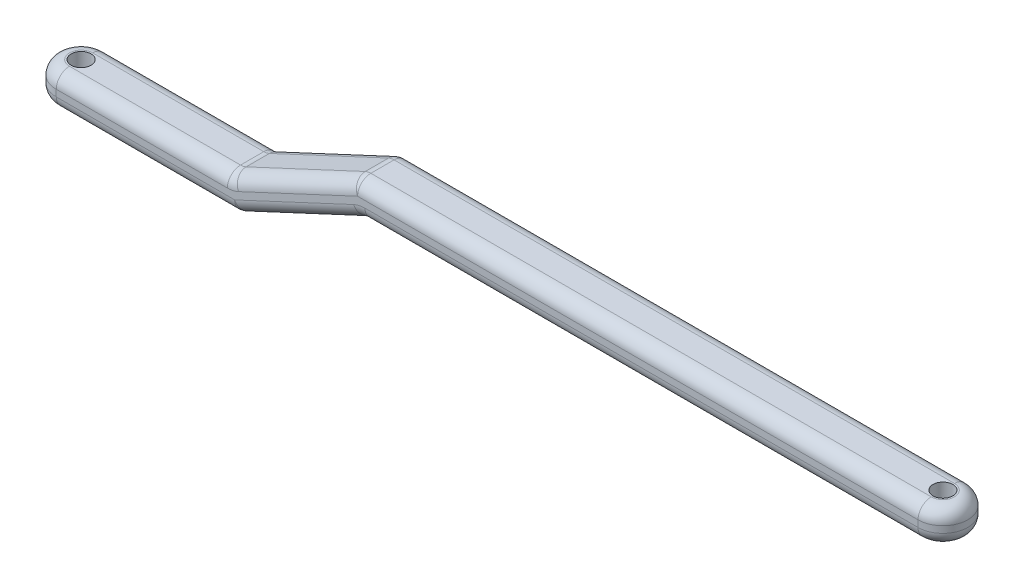
ISO-10303-21;
HEADER;
FILE_DESCRIPTION(('STEP AP214'),'2;1');
FILE_NAME('part.step','',(''),(''),'','','');
FILE_SCHEMA(('AUTOMOTIVE_DESIGN { 1 0 10303 214 1 1 1 1 }'));
ENDSEC;
DATA;
#1=APPLICATION_CONTEXT('core data for automotive mechanical design processes');
#2=APPLICATION_PROTOCOL_DEFINITION('international standard','automotive_design',2000,#1);
#3=PRODUCT_CONTEXT('',#1,'mechanical');
#4=PRODUCT('Part','Part','',(#3));
#5=PRODUCT_RELATED_PRODUCT_CATEGORY('part','',(#4));
#6=PRODUCT_DEFINITION_FORMATION('','',#4);
#7=PRODUCT_DEFINITION_CONTEXT('part definition',#1,'design');
#8=PRODUCT_DEFINITION('design','',#6,#7);
#9=PRODUCT_DEFINITION_SHAPE('','',#8);
#10=(LENGTH_UNIT() NAMED_UNIT(*) SI_UNIT(.MILLI.,.METRE.));
#11=(NAMED_UNIT(*) PLANE_ANGLE_UNIT() SI_UNIT($,.RADIAN.));
#12=(NAMED_UNIT(*) SI_UNIT($,.STERADIAN.) SOLID_ANGLE_UNIT());
#13=UNCERTAINTY_MEASURE_WITH_UNIT(LENGTH_MEASURE(1.E-05),#10,'distance_accuracy_value','');
#14=(GEOMETRIC_REPRESENTATION_CONTEXT(3) GLOBAL_UNCERTAINTY_ASSIGNED_CONTEXT((#13)) GLOBAL_UNIT_ASSIGNED_CONTEXT((#10,
#11,#12)) REPRESENTATION_CONTEXT('',''));
#15=CARTESIAN_POINT('',(0.,0.,0.));
#16=DIRECTION('',(0.,0.,1.));
#17=DIRECTION('',(1.,0.,0.));
#18=AXIS2_PLACEMENT_3D('',#15,#16,#17);
#19=CARTESIAN_POINT('',(0.,13.75,0.));
#20=DIRECTION('',(0.,1.,0.));
#21=DIRECTION('',(0.,0.,1.));
#22=AXIS2_PLACEMENT_3D('',#19,#20,#21);
#23=PLANE('',#22);
#24=DIRECTION('',(-1.,0.,0.));
#25=VECTOR('',#24,1.);
#26=CARTESIAN_POINT('',(-169.971128891083,13.75,-3.5));
#27=LINE('',#26,#25);
#28=CARTESIAN_POINT('',(0.,13.75,-3.5));
#29=VERTEX_POINT('',#28);
#30=CARTESIAN_POINT('',(-169.084350240511,13.75,-3.5));
#31=VERTEX_POINT('',#30);
#32=EDGE_CURVE('E278',#29,#31,#27,.T.);
#33=ORIENTED_EDGE('',*,*,#32,.T.);
#34=DIRECTION('',(0.,0.,1.));
#35=VECTOR('',#34,1.);
#36=CARTESIAN_POINT('',(-169.084350240511,13.75,0.));
#37=LINE('',#36,#35);
#38=CARTESIAN_POINT('',(-169.084350240511,13.75,3.5));
#39=VERTEX_POINT('',#38);
#40=EDGE_CURVE('E283',#31,#39,#37,.T.);
#41=ORIENTED_EDGE('',*,*,#40,.T.);
#42=DIRECTION('',(1.,0.,0.));
#43=VECTOR('',#42,1.);
#44=CARTESIAN_POINT('',(0.,13.75,3.5));
#45=LINE('',#44,#43);
#46=CARTESIAN_POINT('',(0.,13.75,3.5));
#47=VERTEX_POINT('',#46);
#48=EDGE_CURVE('E280',#39,#47,#45,.T.);
#49=ORIENTED_EDGE('',*,*,#48,.T.);
#50=CARTESIAN_POINT('',(0.,13.75,0.));
#51=DIRECTION('',(0.,1.,0.));
#52=DIRECTION('',(0.,0.,1.));
#53=AXIS2_PLACEMENT_3D('',#50,#51,#52);
#54=CIRCLE('',#53,3.5);
#55=EDGE_CURVE('E276',#47,#29,#54,.T.);
#56=ORIENTED_EDGE('',*,*,#55,.T.);
#57=EDGE_LOOP('',(#33,#41,#49,#56));
#58=FACE_BOUND('',#57,.T.);
#59=CARTESIAN_POINT('',(0.,13.75,0.));
#60=DIRECTION('',(0.,1.,0.));
#61=DIRECTION('',(0.,0.,1.));
#62=AXIS2_PLACEMENT_3D('',#59,#60,#61);
#63=CIRCLE('',#62,3.);
#64=CARTESIAN_POINT('',(0.,13.75,3.));
#65=VERTEX_POINT('',#64);
#66=EDGE_CURVE('E840',#65,#65,#63,.T.);
#67=ORIENTED_EDGE('',*,*,#66,.F.);
#68=EDGE_LOOP('',(#67));
#69=FACE_BOUND('',#68,.T.);
#70=ADVANCED_FACE('F41',(#58,#69),#23,.T.);
#71=CARTESIAN_POINT('',(0.,-13.75,0.));
#72=DIRECTION('',(0.,1.,0.));
#73=DIRECTION('',(0.,0.,1.));
#74=AXIS2_PLACEMENT_3D('',#71,#72,#73);
#75=PLANE('',#74);
#76=DIRECTION('',(0.,0.,1.));
#77=VECTOR('',#76,1.);
#78=CARTESIAN_POINT('',(-206.169832024142,-13.75,7.5));
#79=LINE('',#78,#77);
#80=CARTESIAN_POINT('',(-206.169832024142,-13.75,-3.5));
#81=VERTEX_POINT('',#80);
#82=CARTESIAN_POINT('',(-206.169832024142,-13.75,3.5));
#83=VERTEX_POINT('',#82);
#84=EDGE_CURVE('E796',#81,#83,#79,.T.);
#85=ORIENTED_EDGE('',*,*,#84,.T.);
#86=DIRECTION('',(1.,0.,0.));
#87=VECTOR('',#86,1.);
#88=CARTESIAN_POINT('',(0.,-13.75,3.5));
#89=LINE('',#88,#87);
#90=CARTESIAN_POINT('',(-260.,-13.75,3.5));
#91=VERTEX_POINT('',#90);
#92=EDGE_CURVE('E228',#83,#91,#89,.F.);
#93=ORIENTED_EDGE('',*,*,#92,.T.);
#94=CARTESIAN_POINT('',(-260.,-13.75,0.));
#95=DIRECTION('',(0.,1.,0.));
#96=DIRECTION('',(0.,0.,1.));
#97=AXIS2_PLACEMENT_3D('',#94,#95,#96);
#98=CIRCLE('',#97,3.5);
#99=CARTESIAN_POINT('',(-260.,-13.75,-3.5));
#100=VERTEX_POINT('',#99);
#101=EDGE_CURVE('E233',#91,#100,#98,.F.);
#102=ORIENTED_EDGE('',*,*,#101,.T.);
#103=DIRECTION('',(-1.,0.,0.));
#104=VECTOR('',#103,1.);
#105=CARTESIAN_POINT('',(0.,-13.75,-3.5));
#106=LINE('',#105,#104);
#107=EDGE_CURVE('E794',#100,#81,#106,.F.);
#108=ORIENTED_EDGE('',*,*,#107,.T.);
#109=EDGE_LOOP('',(#85,#93,#102,#108));
#110=FACE_BOUND('',#109,.T.);
#111=CARTESIAN_POINT('',(-260.,-13.75,0.));
#112=DIRECTION('',(0.,1.,0.));
#113=DIRECTION('',(0.,0.,1.));
#114=AXIS2_PLACEMENT_3D('',#111,#112,#113);
#115=CIRCLE('',#114,2.99999999999999);
#116=CARTESIAN_POINT('',(-260.,-13.75,2.99999999999999));
#117=VERTEX_POINT('',#116);
#118=EDGE_CURVE('E760',#117,#117,#115,.T.);
#119=ORIENTED_EDGE('',*,*,#118,.T.);
#120=EDGE_LOOP('',(#119));
#121=FACE_BOUND('',#120,.T.);
#122=ADVANCED_FACE('F421',(#110,#121),#75,.F.);
#123=CARTESIAN_POINT('',(0.,13.75,0.));
#124=DIRECTION('',(0.,-1.,0.));
#125=DIRECTION('',(0.,0.,-1.));
#126=AXIS2_PLACEMENT_3D('',#123,#124,#125);
#127=CYLINDRICAL_SURFACE('',#126,7.5);
#128=DIRECTION('',(0.,-1.,0.));
#129=VECTOR('',#128,1.);
#130=CARTESIAN_POINT('',(0.,13.75,7.5));
#131=LINE('',#130,#129);
#132=CARTESIAN_POINT('',(0.,9.75,7.5));
#133=VERTEX_POINT('',#132);
#134=CARTESIAN_POINT('',(0.,7.75,7.5));
#135=VERTEX_POINT('',#134);
#136=EDGE_CURVE('E213',#133,#135,#131,.T.);
#137=ORIENTED_EDGE('',*,*,#136,.T.);
#138=CARTESIAN_POINT('',(0.,7.75,0.));
#139=DIRECTION('',(0.,-1.,0.));
#140=DIRECTION('',(0.,0.,-1.));
#141=AXIS2_PLACEMENT_3D('',#138,#139,#140);
#142=CIRCLE('',#141,7.5);
#143=CARTESIAN_POINT('',(0.,7.75,-7.5));
#144=VERTEX_POINT('',#143);
#145=EDGE_CURVE('E247',#135,#144,#142,.F.);
#146=ORIENTED_EDGE('',*,*,#145,.T.);
#147=DIRECTION('',(0.,-1.,0.));
#148=VECTOR('',#147,1.);
#149=CARTESIAN_POINT('',(0.,13.75,-7.5));
#150=LINE('',#149,#148);
#151=CARTESIAN_POINT('',(0.,9.75,-7.5));
#152=VERTEX_POINT('',#151);
#153=EDGE_CURVE('E769',#152,#144,#150,.T.);
#154=ORIENTED_EDGE('',*,*,#153,.F.);
#155=CARTESIAN_POINT('',(0.,9.75,0.));
#156=DIRECTION('',(0.,1.,0.));
#157=DIRECTION('',(0.,0.,1.));
#158=AXIS2_PLACEMENT_3D('',#155,#156,#157);
#159=CIRCLE('',#158,7.5);
#160=EDGE_CURVE('E245',#152,#133,#159,.F.);
#161=ORIENTED_EDGE('',*,*,#160,.T.);
#162=EDGE_LOOP('',(#137,#146,#154,#161));
#163=FACE_BOUND('',#162,.T.);
#164=ADVANCED_FACE('F427',(#163),#127,.T.);
#165=CARTESIAN_POINT('',(0.,13.75,-7.5));
#166=DIRECTION('',(0.,0.,1.));
#167=DIRECTION('',(1.,0.,0.));
#168=AXIS2_PLACEMENT_3D('',#165,#166,#167);
#169=PLANE('',#168);
#170=DIRECTION('',(0.906307787036649,0.422618261740701,0.));
#171=VECTOR('',#170,1.);
#172=CARTESIAN_POINT('',(-206.973526420533,-10.1247688518534,-7.5));
#173=LINE('',#172,#171);
#174=CARTESIAN_POINT('',(-170.248349708007,7.00046229629319,-7.5));
#175=VERTEX_POINT('',#174);
#176=CARTESIAN_POINT('',(-206.169832024142,-9.75,-7.5));
#177=VERTEX_POINT('',#176);
#178=EDGE_CURVE('E267',#175,#177,#173,.F.);
#179=ORIENTED_EDGE('',*,*,#178,.T.);
#180=DIRECTION('',(-1.,0.,0.));
#181=VECTOR('',#180,1.);
#182=CARTESIAN_POINT('',(0.,-9.75,-7.5));
#183=LINE('',#182,#181);
#184=CARTESIAN_POINT('',(-260.,-9.75,-7.5));
#185=VERTEX_POINT('',#184);
#186=EDGE_CURVE('E274',#177,#185,#183,.T.);
#187=ORIENTED_EDGE('',*,*,#186,.T.);
#188=DIRECTION('',(0.,-1.,0.));
#189=VECTOR('',#188,1.);
#190=CARTESIAN_POINT('',(-260.,13.75,-7.5));
#191=LINE('',#190,#189);
#192=CARTESIAN_POINT('',(-260.,-7.75,-7.5));
#193=VERTEX_POINT('',#192);
#194=EDGE_CURVE('E212',#193,#185,#191,.T.);
#195=ORIENTED_EDGE('',*,*,#194,.F.);
#196=DIRECTION('',(-1.,0.,0.));
#197=VECTOR('',#196,1.);
#198=CARTESIAN_POINT('',(-207.5,-7.74999999999999,-7.5));
#199=LINE('',#198,#197);
#200=CARTESIAN_POINT('',(-208.386778650572,-7.74999999999999,-7.5));
#201=VERTEX_POINT('',#200);
#202=EDGE_CURVE('E264',#193,#201,#199,.F.);
#203=ORIENTED_EDGE('',*,*,#202,.T.);
#204=CARTESIAN_POINT('',(-208.386778650572,0.250000000000007,-7.5));
#205=DIRECTION('',(0.,0.,1.));
#206=DIRECTION('',(1.,0.,0.));
#207=AXIS2_PLACEMENT_3D('',#204,#205,#206);
#208=CIRCLE('',#207,8.);
#209=CARTESIAN_POINT('',(-205.005832556646,-7.00046229629318,-7.5));
#210=VERTEX_POINT('',#209);
#211=EDGE_CURVE('E261',#210,#201,#208,.F.);
#212=ORIENTED_EDGE('',*,*,#211,.F.);
#213=DIRECTION('',(-0.906307787036649,-0.422618261740701,0.));
#214=VECTOR('',#213,1.);
#215=CARTESIAN_POINT('',(-168.28065584412,10.1247688518534,-7.5));
#216=LINE('',#215,#214);
#217=CARTESIAN_POINT('',(-169.084350240511,9.74999999999999,-7.5));
#218=VERTEX_POINT('',#217);
#219=EDGE_CURVE('E257',#210,#218,#216,.F.);
#220=ORIENTED_EDGE('',*,*,#219,.T.);
#221=DIRECTION('',(-1.,0.,0.));
#222=VECTOR('',#221,1.);
#223=CARTESIAN_POINT('',(0.,9.75,-7.5));
#224=LINE('',#223,#222);
#225=EDGE_CURVE('E259',#218,#152,#224,.F.);
#226=ORIENTED_EDGE('',*,*,#225,.T.);
#227=ORIENTED_EDGE('',*,*,#153,.T.);
#228=DIRECTION('',(1.,0.,0.));
#229=VECTOR('',#228,1.);
#230=CARTESIAN_POINT('',(-167.754182264654,7.75,-7.5));
#231=LINE('',#230,#229);
#232=CARTESIAN_POINT('',(-166.867403614082,7.75,-7.5));
#233=VERTEX_POINT('',#232);
#234=EDGE_CURVE('E272',#144,#233,#231,.F.);
#235=ORIENTED_EDGE('',*,*,#234,.T.);
#236=CARTESIAN_POINT('',(-166.867403614082,-0.25,-7.5));
#237=DIRECTION('',(0.,0.,1.));
#238=DIRECTION('',(1.,0.,0.));
#239=AXIS2_PLACEMENT_3D('',#236,#237,#238);
#240=CIRCLE('',#239,8.);
#241=EDGE_CURVE('E269',#175,#233,#240,.F.);
#242=ORIENTED_EDGE('',*,*,#241,.F.);
#243=EDGE_LOOP('',(#179,#187,#195,#203,#212,#220,#226,#227,#235,#242));
#244=FACE_BOUND('',#243,.T.);
#245=ADVANCED_FACE('F438',(#244),#169,.F.);
#246=CARTESIAN_POINT('',(-260.,13.75,0.));
#247=DIRECTION('',(0.,-1.,0.));
#248=DIRECTION('',(0.,0.,-1.));
#249=AXIS2_PLACEMENT_3D('',#246,#247,#248);
#250=CYLINDRICAL_SURFACE('',#249,7.5);
#251=ORIENTED_EDGE('',*,*,#194,.T.);
#252=CARTESIAN_POINT('',(-260.,-9.75,0.));
#253=DIRECTION('',(0.,1.,0.));
#254=DIRECTION('',(0.,0.,1.));
#255=AXIS2_PLACEMENT_3D('',#252,#253,#254);
#256=CIRCLE('',#255,7.5);
#257=CARTESIAN_POINT('',(-260.,-9.75,7.5));
#258=VERTEX_POINT('',#257);
#259=EDGE_CURVE('E211',#185,#258,#256,.T.);
#260=ORIENTED_EDGE('',*,*,#259,.T.);
#261=DIRECTION('',(0.,-1.,0.));
#262=VECTOR('',#261,1.);
#263=CARTESIAN_POINT('',(-260.,13.75,7.5));
#264=LINE('',#263,#262);
#265=CARTESIAN_POINT('',(-260.,-7.75,7.5));
#266=VERTEX_POINT('',#265);
#267=EDGE_CURVE('E193',#266,#258,#264,.T.);
#268=ORIENTED_EDGE('',*,*,#267,.F.);
#269=CARTESIAN_POINT('',(-260.,-7.75,0.));
#270=DIRECTION('',(0.,1.,0.));
#271=DIRECTION('',(-1.,0.,0.));
#272=AXIS2_PLACEMENT_3D('',#269,#270,#271);
#273=CIRCLE('',#272,7.5);
#274=EDGE_CURVE('E208',#266,#193,#273,.F.);
#275=ORIENTED_EDGE('',*,*,#274,.T.);
#276=EDGE_LOOP('',(#251,#260,#268,#275));
#277=FACE_BOUND('',#276,.T.);
#278=ADVANCED_FACE('F206',(#277),#250,.T.);
#279=CARTESIAN_POINT('',(0.,13.75,7.5));
#280=DIRECTION('',(0.,0.,-1.));
#281=DIRECTION('',(-1.,0.,0.));
#282=AXIS2_PLACEMENT_3D('',#279,#280,#281);
#283=PLANE('',#282);
#284=ORIENTED_EDGE('',*,*,#267,.T.);
#285=DIRECTION('',(1.,0.,0.));
#286=VECTOR('',#285,1.);
#287=CARTESIAN_POINT('',(0.,-9.75,7.5));
#288=LINE('',#287,#286);
#289=CARTESIAN_POINT('',(-206.169832024142,-9.75,7.5));
#290=VERTEX_POINT('',#289);
#291=EDGE_CURVE('E783',#258,#290,#288,.T.);
#292=ORIENTED_EDGE('',*,*,#291,.T.);
#293=DIRECTION('',(0.906307787036649,0.422618261740701,0.));
#294=VECTOR('',#293,1.);
#295=CARTESIAN_POINT('',(-169.444655311616,7.37523114814662,7.5));
#296=LINE('',#295,#294);
#297=CARTESIAN_POINT('',(-170.248349708007,7.0004622962932,7.5));
#298=VERTEX_POINT('',#297);
#299=EDGE_CURVE('E780',#290,#298,#296,.T.);
#300=ORIENTED_EDGE('',*,*,#299,.T.);
#301=CARTESIAN_POINT('',(-166.867403614082,-0.25,7.5));
#302=DIRECTION('',(0.,0.,-1.));
#303=DIRECTION('',(-1.,0.,0.));
#304=AXIS2_PLACEMENT_3D('',#301,#302,#303);
#305=CIRCLE('',#304,8.);
#306=CARTESIAN_POINT('',(-166.867403614082,7.75,7.5));
#307=VERTEX_POINT('',#306);
#308=EDGE_CURVE('E777',#307,#298,#305,.F.);
#309=ORIENTED_EDGE('',*,*,#308,.F.);
#310=DIRECTION('',(1.,0.,0.));
#311=VECTOR('',#310,1.);
#312=CARTESIAN_POINT('',(0.,7.75,7.5));
#313=LINE('',#312,#311);
#314=EDGE_CURVE('E775',#307,#135,#313,.T.);
#315=ORIENTED_EDGE('',*,*,#314,.T.);
#316=ORIENTED_EDGE('',*,*,#136,.F.);
#317=DIRECTION('',(1.,0.,0.));
#318=VECTOR('',#317,1.);
#319=CARTESIAN_POINT('',(-169.971128891083,9.75,7.5));
#320=LINE('',#319,#318);
#321=CARTESIAN_POINT('',(-169.084350240511,9.75,7.5));
#322=VERTEX_POINT('',#321);
#323=EDGE_CURVE('E201',#133,#322,#320,.F.);
#324=ORIENTED_EDGE('',*,*,#323,.T.);
#325=DIRECTION('',(-0.906307787036649,-0.422618261740701,0.));
#326=VECTOR('',#325,1.);
#327=CARTESIAN_POINT('',(-205.809526953037,-7.37523114814662,7.5));
#328=LINE('',#327,#326);
#329=CARTESIAN_POINT('',(-205.005832556646,-7.00046229629318,7.5));
#330=VERTEX_POINT('',#329);
#331=EDGE_CURVE('E202',#322,#330,#328,.T.);
#332=ORIENTED_EDGE('',*,*,#331,.T.);
#333=CARTESIAN_POINT('',(-208.386778650572,0.250000000000007,7.5));
#334=DIRECTION('',(0.,0.,-1.));
#335=DIRECTION('',(-1.,0.,0.));
#336=AXIS2_PLACEMENT_3D('',#333,#334,#335);
#337=CIRCLE('',#336,8.);
#338=CARTESIAN_POINT('',(-208.386778650572,-7.74999999999999,7.5));
#339=VERTEX_POINT('',#338);
#340=EDGE_CURVE('E196',#339,#330,#337,.F.);
#341=ORIENTED_EDGE('',*,*,#340,.F.);
#342=DIRECTION('',(-1.,0.,0.));
#343=VECTOR('',#342,1.);
#344=CARTESIAN_POINT('',(-260.,-7.75,7.5));
#345=LINE('',#344,#343);
#346=EDGE_CURVE('E190',#339,#266,#345,.T.);
#347=ORIENTED_EDGE('',*,*,#346,.T.);
#348=EDGE_LOOP('',(#284,#292,#300,#309,#315,#316,#324,#332,#341,#347));
#349=FACE_BOUND('',#348,.T.);
#350=ADVANCED_FACE('F192',(#349),#283,.F.);
#351=CARTESIAN_POINT('',(0.,13.75,0.));
#352=DIRECTION('',(0.,-1.,0.));
#353=DIRECTION('',(0.,0.,-1.));
#354=AXIS2_PLACEMENT_3D('',#351,#352,#353);
#355=CYLINDRICAL_SURFACE('',#354,3.);
#356=ORIENTED_EDGE('',*,*,#66,.T.);
#357=EDGE_LOOP('',(#356));
#358=FACE_BOUND('',#357,.T.);
#359=CARTESIAN_POINT('',(0.,3.75,0.));
#360=DIRECTION('',(0.,-1.,0.));
#361=DIRECTION('',(0.,0.,-1.));
#362=AXIS2_PLACEMENT_3D('',#359,#360,#361);
#363=CIRCLE('',#362,3.);
#364=CARTESIAN_POINT('',(0.,3.75,-3.));
#365=VERTEX_POINT('',#364);
#366=EDGE_CURVE('E764',#365,#365,#363,.T.);
#367=ORIENTED_EDGE('',*,*,#366,.T.);
#368=EDGE_LOOP('',(#367));
#369=FACE_BOUND('',#368,.T.);
#370=ADVANCED_FACE('F431',(#358,#369),#355,.F.);
#371=CARTESIAN_POINT('',(-260.,13.75,0.));
#372=DIRECTION('',(0.,-1.,0.));
#373=DIRECTION('',(0.,0.,-1.));
#374=AXIS2_PLACEMENT_3D('',#371,#372,#373);
#375=CYLINDRICAL_SURFACE('',#374,2.99999999999999);
#376=ORIENTED_EDGE('',*,*,#118,.F.);
#377=EDGE_LOOP('',(#376));
#378=FACE_BOUND('',#377,.T.);
#379=CARTESIAN_POINT('',(-260.,-3.75,0.));
#380=DIRECTION('',(0.,1.,0.));
#381=DIRECTION('',(-1.,0.,0.));
#382=AXIS2_PLACEMENT_3D('',#379,#380,#381);
#383=CIRCLE('',#382,2.99999999999999);
#384=CARTESIAN_POINT('',(-263.,-3.75,0.));
#385=VERTEX_POINT('',#384);
#386=EDGE_CURVE('E333',#385,#385,#383,.T.);
#387=ORIENTED_EDGE('',*,*,#386,.T.);
#388=EDGE_LOOP('',(#387));
#389=FACE_BOUND('',#388,.T.);
#390=ADVANCED_FACE('F705',(#378,#389),#375,.F.);
#391=CARTESIAN_POINT('',(-267.5,-3.75,-7.5));
#392=DIRECTION('',(0.,1.,0.));
#393=DIRECTION('',(-1.,0.,0.));
#394=AXIS2_PLACEMENT_3D('',#391,#392,#393);
#395=PLANE('',#394);
#396=DIRECTION('',(0.,0.,1.));
#397=VECTOR('',#396,1.);
#398=CARTESIAN_POINT('',(-208.386778650572,-3.74999999999999,-7.5));
#399=LINE('',#398,#397);
#400=CARTESIAN_POINT('',(-208.386778650572,-3.74999999999999,3.5));
#401=VERTEX_POINT('',#400);
#402=CARTESIAN_POINT('',(-208.386778650572,-3.74999999999999,-3.5));
#403=VERTEX_POINT('',#402);
#404=EDGE_CURVE('E250',#401,#403,#399,.F.);
#405=ORIENTED_EDGE('',*,*,#404,.T.);
#406=DIRECTION('',(-1.,0.,0.));
#407=VECTOR('',#406,1.);
#408=CARTESIAN_POINT('',(-260.,-3.75,-3.5));
#409=LINE('',#408,#407);
#410=CARTESIAN_POINT('',(-260.,-3.75,-3.5));
#411=VERTEX_POINT('',#410);
#412=EDGE_CURVE('E254',#403,#411,#409,.T.);
#413=ORIENTED_EDGE('',*,*,#412,.T.);
#414=CARTESIAN_POINT('',(-260.,-3.75,0.));
#415=DIRECTION('',(0.,1.,0.));
#416=DIRECTION('',(-1.,0.,0.));
#417=AXIS2_PLACEMENT_3D('',#414,#415,#416);
#418=CIRCLE('',#417,3.5);
#419=CARTESIAN_POINT('',(-260.,-3.75,3.5));
#420=VERTEX_POINT('',#419);
#421=EDGE_CURVE('E252',#411,#420,#418,.T.);
#422=ORIENTED_EDGE('',*,*,#421,.T.);
#423=DIRECTION('',(-1.,0.,0.));
#424=VECTOR('',#423,1.);
#425=CARTESIAN_POINT('',(-207.5,-3.74999999999999,3.5));
#426=LINE('',#425,#424);
#427=EDGE_CURVE('E219',#420,#401,#426,.F.);
#428=ORIENTED_EDGE('',*,*,#427,.T.);
#429=EDGE_LOOP('',(#405,#413,#422,#428));
#430=FACE_BOUND('',#429,.T.);
#431=ORIENTED_EDGE('',*,*,#386,.F.);
#432=EDGE_LOOP('',(#431));
#433=FACE_BOUND('',#432,.T.);
#434=ADVANCED_FACE('F698',(#430,#433),#395,.T.);
#435=CARTESIAN_POINT('',(-207.5,-3.74999999999999,-7.5));
#436=DIRECTION('',(-0.422618261740701,0.906307787036649,0.));
#437=DIRECTION('',(-0.906307787036649,-0.422618261740701,0.));
#438=AXIS2_PLACEMENT_3D('',#435,#436,#437);
#439=PLANE('',#438);
#440=DIRECTION('',(0.,0.,1.));
#441=VECTOR('',#440,1.);
#442=CARTESIAN_POINT('',(-170.774823287474,13.3752311481466,-7.5));
#443=LINE('',#442,#441);
#444=CARTESIAN_POINT('',(-170.774823287474,13.3752311481466,3.5));
#445=VERTEX_POINT('',#444);
#446=CARTESIAN_POINT('',(-170.774823287474,13.3752311481466,-3.5));
#447=VERTEX_POINT('',#446);
#448=EDGE_CURVE('E61',#445,#447,#443,.F.);
#449=ORIENTED_EDGE('',*,*,#448,.T.);
#450=DIRECTION('',(-0.906307787036649,-0.422618261740701,0.));
#451=VECTOR('',#450,1.);
#452=CARTESIAN_POINT('',(-207.5,-3.74999999999999,-3.5));
#453=LINE('',#452,#451);
#454=CARTESIAN_POINT('',(-206.696305603609,-3.37523114814658,-3.5));
#455=VERTEX_POINT('',#454);
#456=EDGE_CURVE('E12',#447,#455,#453,.T.);
#457=ORIENTED_EDGE('',*,*,#456,.T.);
#458=DIRECTION('',(0.,0.,1.));
#459=VECTOR('',#458,1.);
#460=CARTESIAN_POINT('',(-206.696305603609,-3.37523114814658,7.5));
#461=LINE('',#460,#459);
#462=CARTESIAN_POINT('',(-206.696305603609,-3.37523114814658,3.5));
#463=VERTEX_POINT('',#462);
#464=EDGE_CURVE('E50',#455,#463,#461,.T.);
#465=ORIENTED_EDGE('',*,*,#464,.T.);
#466=DIRECTION('',(-0.906307787036649,-0.422618261740701,0.));
#467=VECTOR('',#466,1.);
#468=CARTESIAN_POINT('',(-169.971128891083,13.75,3.5));
#469=LINE('',#468,#467);
#470=EDGE_CURVE('E285',#463,#445,#469,.F.);
#471=ORIENTED_EDGE('',*,*,#470,.T.);
#472=EDGE_LOOP('',(#449,#457,#465,#471));
#473=FACE_BOUND('',#472,.T.);
#474=ADVANCED_FACE('F406',(#473),#439,.T.);
#475=CARTESIAN_POINT('',(7.5,3.75,-7.5));
#476=DIRECTION('',(0.,-1.,0.));
#477=DIRECTION('',(0.,0.,-1.));
#478=AXIS2_PLACEMENT_3D('',#475,#476,#477);
#479=PLANE('',#478);
#480=CARTESIAN_POINT('',(0.,3.75,0.));
#481=DIRECTION('',(0.,-1.,0.));
#482=DIRECTION('',(0.,0.,-1.));
#483=AXIS2_PLACEMENT_3D('',#480,#481,#482);
#484=CIRCLE('',#483,3.5);
#485=CARTESIAN_POINT('',(0.,3.75,-3.5));
#486=VERTEX_POINT('',#485);
#487=CARTESIAN_POINT('',(0.,3.75,3.5));
#488=VERTEX_POINT('',#487);
#489=EDGE_CURVE('E240',#486,#488,#484,.T.);
#490=ORIENTED_EDGE('',*,*,#489,.T.);
#491=DIRECTION('',(1.,0.,0.));
#492=VECTOR('',#491,1.);
#493=CARTESIAN_POINT('',(-167.754182264654,3.75,3.5));
#494=LINE('',#493,#492);
#495=CARTESIAN_POINT('',(-166.867403614082,3.75,3.5));
#496=VERTEX_POINT('',#495);
#497=EDGE_CURVE('E242',#488,#496,#494,.F.);
#498=ORIENTED_EDGE('',*,*,#497,.T.);
#499=DIRECTION('',(0.,0.,1.));
#500=VECTOR('',#499,1.);
#501=CARTESIAN_POINT('',(-166.867403614082,3.75,-7.5));
#502=LINE('',#501,#500);
#503=CARTESIAN_POINT('',(-166.867403614082,3.75,-3.5));
#504=VERTEX_POINT('',#503);
#505=EDGE_CURVE('E238',#496,#504,#502,.F.);
#506=ORIENTED_EDGE('',*,*,#505,.T.);
#507=DIRECTION('',(1.,0.,0.));
#508=VECTOR('',#507,1.);
#509=CARTESIAN_POINT('',(0.,3.75,-3.5));
#510=LINE('',#509,#508);
#511=EDGE_CURVE('E230',#504,#486,#510,.T.);
#512=ORIENTED_EDGE('',*,*,#511,.T.);
#513=EDGE_LOOP('',(#490,#498,#506,#512));
#514=FACE_BOUND('',#513,.T.);
#515=ORIENTED_EDGE('',*,*,#366,.F.);
#516=EDGE_LOOP('',(#515));
#517=FACE_BOUND('',#516,.T.);
#518=ADVANCED_FACE('F681',(#514,#517),#479,.T.);
#519=CARTESIAN_POINT('',(-167.754182264654,3.75,-7.5));
#520=DIRECTION('',(0.422618261740701,-0.906307787036649,0.));
#521=DIRECTION('',(0.906307787036649,0.422618261740701,0.));
#522=AXIS2_PLACEMENT_3D('',#519,#520,#521);
#523=PLANE('',#522);
#524=DIRECTION('',(0.,0.,1.));
#525=VECTOR('',#524,1.);
#526=CARTESIAN_POINT('',(-168.557876661045,3.37523114814659,7.5));
#527=LINE('',#526,#525);
#528=CARTESIAN_POINT('',(-168.557876661045,3.37523114814659,-3.5));
#529=VERTEX_POINT('',#528);
#530=CARTESIAN_POINT('',(-168.557876661045,3.37523114814659,3.5));
#531=VERTEX_POINT('',#530);
#532=EDGE_CURVE('E789',#529,#531,#527,.T.);
#533=ORIENTED_EDGE('',*,*,#532,.T.);
#534=DIRECTION('',(0.906307787036649,0.422618261740701,0.));
#535=VECTOR('',#534,1.);
#536=CARTESIAN_POINT('',(-205.283053373571,-13.75,3.5));
#537=LINE('',#536,#535);
#538=CARTESIAN_POINT('',(-204.47935897718,-13.3752311481466,3.5));
#539=VERTEX_POINT('',#538);
#540=EDGE_CURVE('E791',#531,#539,#537,.F.);
#541=ORIENTED_EDGE('',*,*,#540,.T.);
#542=DIRECTION('',(0.,0.,1.));
#543=VECTOR('',#542,1.);
#544=CARTESIAN_POINT('',(-204.47935897718,-13.3752311481466,-7.5));
#545=LINE('',#544,#543);
#546=CARTESIAN_POINT('',(-204.47935897718,-13.3752311481466,-3.5));
#547=VERTEX_POINT('',#546);
#548=EDGE_CURVE('E787',#539,#547,#545,.F.);
#549=ORIENTED_EDGE('',*,*,#548,.T.);
#550=DIRECTION('',(0.906307787036649,0.422618261740701,0.));
#551=VECTOR('',#550,1.);
#552=CARTESIAN_POINT('',(-167.754182264654,3.75,-3.5));
#553=LINE('',#552,#551);
#554=EDGE_CURVE('E785',#547,#529,#553,.T.);
#555=ORIENTED_EDGE('',*,*,#554,.T.);
#556=EDGE_LOOP('',(#533,#541,#549,#555));
#557=FACE_BOUND('',#556,.T.);
#558=ADVANCED_FACE('F500',(#557),#523,.T.);
#559=CARTESIAN_POINT('',(0.,-9.75,-3.5));
#560=DIRECTION('',(-1.,0.,0.));
#561=DIRECTION('',(0.,0.,1.));
#562=AXIS2_PLACEMENT_3D('',#559,#560,#561);
#563=CYLINDRICAL_SURFACE('',#562,4.);
#564=CARTESIAN_POINT('',(-260.,-9.75,-3.5));
#565=DIRECTION('',(-1.,0.,0.));
#566=DIRECTION('',(0.,0.,1.));
#567=AXIS2_PLACEMENT_3D('',#564,#565,#566);
#568=CIRCLE('',#567,4.);
#569=EDGE_CURVE('E324',#185,#100,#568,.T.);
#570=ORIENTED_EDGE('',*,*,#569,.F.);
#571=ORIENTED_EDGE('',*,*,#186,.F.);
#572=CARTESIAN_POINT('',(-206.169832024142,-9.75,-3.5));
#573=DIRECTION('',(1.,0.,0.));
#574=DIRECTION('',(0.,0.,-1.));
#575=AXIS2_PLACEMENT_3D('',#572,#573,#574);
#576=CIRCLE('',#575,4.);
#577=EDGE_CURVE('E327',#81,#177,#576,.T.);
#578=ORIENTED_EDGE('',*,*,#577,.F.);
#579=ORIENTED_EDGE('',*,*,#107,.F.);
#580=EDGE_LOOP('',(#570,#571,#578,#579));
#581=FACE_BOUND('',#580,.T.);
#582=ADVANCED_FACE('F496',(#581),#563,.T.);
#583=CARTESIAN_POINT('',(7.5,7.75,-3.5));
#584=DIRECTION('',(-1.,0.,0.));
#585=DIRECTION('',(0.,0.,1.));
#586=AXIS2_PLACEMENT_3D('',#583,#584,#585);
#587=CYLINDRICAL_SURFACE('',#586,4.);
#588=CARTESIAN_POINT('',(-166.867403614082,7.75,-3.5));
#589=DIRECTION('',(-1.,0.,0.));
#590=DIRECTION('',(0.,0.,1.));
#591=AXIS2_PLACEMENT_3D('',#588,#589,#590);
#592=CIRCLE('',#591,4.);
#593=EDGE_CURVE('E318',#233,#504,#592,.T.);
#594=ORIENTED_EDGE('',*,*,#593,.F.);
#595=ORIENTED_EDGE('',*,*,#234,.F.);
#596=CARTESIAN_POINT('',(0.,7.75,-3.5));
#597=DIRECTION('',(1.,0.,0.));
#598=DIRECTION('',(0.,0.,-1.));
#599=AXIS2_PLACEMENT_3D('',#596,#597,#598);
#600=CIRCLE('',#599,4.);
#601=EDGE_CURVE('E321',#486,#144,#600,.T.);
#602=ORIENTED_EDGE('',*,*,#601,.F.);
#603=ORIENTED_EDGE('',*,*,#511,.F.);
#604=EDGE_LOOP('',(#594,#595,#602,#603));
#605=FACE_BOUND('',#604,.T.);
#606=ADVANCED_FACE('F492',(#605),#587,.T.);
#607=CARTESIAN_POINT('',(-169.444655311616,7.3752311481466,-3.5));
#608=DIRECTION('',(-0.906307787036649,-0.422618261740701,0.));
#609=DIRECTION('',(0.422618261740701,-0.906307787036649,0.));
#610=AXIS2_PLACEMENT_3D('',#607,#608,#609);
#611=CYLINDRICAL_SURFACE('',#610,4.);
#612=CARTESIAN_POINT('',(-206.169832024142,-9.75,-3.5));
#613=DIRECTION('',(-0.90630778703665,-0.422618261740699,0.));
#614=DIRECTION('',(0.422618261740699,-0.90630778703665,0.));
#615=AXIS2_PLACEMENT_3D('',#612,#613,#614);
#616=CIRCLE('',#615,4.);
#617=EDGE_CURVE('E330',#177,#547,#616,.T.);
#618=ORIENTED_EDGE('',*,*,#617,.F.);
#619=ORIENTED_EDGE('',*,*,#178,.F.);
#620=CARTESIAN_POINT('',(-170.248349708007,7.00046229629319,-3.5));
#621=DIRECTION('',(0.90630778703665,0.422618261740699,0.));
#622=DIRECTION('',(-0.422618261740699,0.90630778703665,0.));
#623=AXIS2_PLACEMENT_3D('',#620,#621,#622);
#624=CIRCLE('',#623,4.);
#625=EDGE_CURVE('E315',#529,#175,#624,.T.);
#626=ORIENTED_EDGE('',*,*,#625,.F.);
#627=ORIENTED_EDGE('',*,*,#554,.F.);
#628=EDGE_LOOP('',(#618,#619,#626,#627));
#629=FACE_BOUND('',#628,.T.);
#630=ADVANCED_FACE('F488',(#629),#611,.T.);
#631=CARTESIAN_POINT('',(-206.169832024142,-9.75,-3.5));
#632=DIRECTION('',(0.,0.,-1.));
#633=DIRECTION('',(0.,1.,0.));
#634=AXIS2_PLACEMENT_3D('',#631,#632,#633);
#635=SPHERICAL_SURFACE('',#634,4.);
#636=ORIENTED_EDGE('',*,*,#577,.T.);
#637=ORIENTED_EDGE('',*,*,#617,.T.);
#638=CARTESIAN_POINT('',(-206.169832024142,-9.74999999999999,-3.5));
#639=DIRECTION('',(0.,0.,-1.));
#640=DIRECTION('',(-1.,0.,0.));
#641=AXIS2_PLACEMENT_3D('',#638,#639,#640);
#642=CIRCLE('',#641,4.);
#643=EDGE_CURVE('E312',#81,#547,#642,.F.);
#644=ORIENTED_EDGE('',*,*,#643,.F.);
#645=EDGE_LOOP('',(#636,#637,#644));
#646=FACE_BOUND('',#645,.T.);
#647=ADVANCED_FACE('F484',(#646),#635,.T.);
#648=CARTESIAN_POINT('',(-260.,-9.75,0.));
#649=DIRECTION('',(0.,1.,0.));
#650=DIRECTION('',(0.,0.,1.));
#651=AXIS2_PLACEMENT_3D('',#648,#649,#650);
#652=DEGENERATE_TOROIDAL_SURFACE('',#651,3.5,4.,.T.);
#653=ORIENTED_EDGE('',*,*,#569,.T.);
#654=ORIENTED_EDGE('',*,*,#101,.F.);
#655=CARTESIAN_POINT('',(-260.,-9.75,3.5));
#656=DIRECTION('',(1.,0.,0.));
#657=DIRECTION('',(0.,0.,-1.));
#658=AXIS2_PLACEMENT_3D('',#655,#656,#657);
#659=CIRCLE('',#658,4.);
#660=EDGE_CURVE('E310',#258,#91,#659,.T.);
#661=ORIENTED_EDGE('',*,*,#660,.F.);
#662=ORIENTED_EDGE('',*,*,#259,.F.);
#663=EDGE_LOOP('',(#653,#654,#661,#662));
#664=FACE_BOUND('',#663,.T.);
#665=ADVANCED_FACE('F480',(#664),#652,.T.);
#666=CARTESIAN_POINT('',(0.,7.75,0.));
#667=DIRECTION('',(0.,-1.,0.));
#668=DIRECTION('',(0.,0.,-1.));
#669=AXIS2_PLACEMENT_3D('',#666,#667,#668);
#670=DEGENERATE_TOROIDAL_SURFACE('',#669,3.5,4.,.T.);
#671=ORIENTED_EDGE('',*,*,#601,.T.);
#672=ORIENTED_EDGE('',*,*,#145,.F.);
#673=CARTESIAN_POINT('',(0.,7.75,3.5));
#674=DIRECTION('',(-1.,0.,0.));
#675=DIRECTION('',(0.,0.,1.));
#676=AXIS2_PLACEMENT_3D('',#673,#674,#675);
#677=CIRCLE('',#676,4.);
#678=EDGE_CURVE('E307',#488,#135,#677,.T.);
#679=ORIENTED_EDGE('',*,*,#678,.F.);
#680=ORIENTED_EDGE('',*,*,#489,.F.);
#681=EDGE_LOOP('',(#671,#672,#679,#680));
#682=FACE_BOUND('',#681,.T.);
#683=ADVANCED_FACE('F476',(#682),#670,.T.);
#684=CARTESIAN_POINT('',(-166.867403614082,-0.25,-3.5));
#685=DIRECTION('',(0.,0.,1.));
#686=DIRECTION('',(1.,0.,0.));
#687=AXIS2_PLACEMENT_3D('',#684,#685,#686);
#688=TOROIDAL_SURFACE('',#687,8.,4.);
#689=ORIENTED_EDGE('',*,*,#241,.T.);
#690=ORIENTED_EDGE('',*,*,#593,.T.);
#691=CARTESIAN_POINT('',(-166.867403614082,-0.25,-3.5));
#692=DIRECTION('',(0.,0.,1.));
#693=DIRECTION('',(1.,0.,0.));
#694=AXIS2_PLACEMENT_3D('',#691,#692,#693);
#695=CIRCLE('',#694,4.);
#696=EDGE_CURVE('E304',#529,#504,#695,.F.);
#697=ORIENTED_EDGE('',*,*,#696,.F.);
#698=ORIENTED_EDGE('',*,*,#625,.T.);
#699=EDGE_LOOP('',(#689,#690,#697,#698));
#700=FACE_BOUND('',#699,.T.);
#701=ADVANCED_FACE('F472',(#700),#688,.T.);
#702=CARTESIAN_POINT('',(-206.169832024142,-9.75,0.));
#703=DIRECTION('',(0.,0.,-1.));
#704=DIRECTION('',(-1.,0.,0.));
#705=AXIS2_PLACEMENT_3D('',#702,#703,#704);
#706=CYLINDRICAL_SURFACE('',#705,4.);
#707=ORIENTED_EDGE('',*,*,#643,.T.);
#708=ORIENTED_EDGE('',*,*,#548,.F.);
#709=CARTESIAN_POINT('',(-206.169832024142,-9.75,3.5));
#710=DIRECTION('',(0.,0.,1.));
#711=DIRECTION('',(1.,0.,0.));
#712=AXIS2_PLACEMENT_3D('',#709,#710,#711);
#713=CIRCLE('',#712,4.);
#714=EDGE_CURVE('E301',#83,#539,#713,.T.);
#715=ORIENTED_EDGE('',*,*,#714,.F.);
#716=ORIENTED_EDGE('',*,*,#84,.F.);
#717=EDGE_LOOP('',(#707,#708,#715,#716));
#718=FACE_BOUND('',#717,.T.);
#719=ADVANCED_FACE('F468',(#718),#706,.T.);
#720=CARTESIAN_POINT('',(0.,-9.75,3.5));
#721=DIRECTION('',(1.,0.,0.));
#722=DIRECTION('',(0.,0.,-1.));
#723=AXIS2_PLACEMENT_3D('',#720,#721,#722);
#724=CYLINDRICAL_SURFACE('',#723,4.);
#725=ORIENTED_EDGE('',*,*,#660,.T.);
#726=ORIENTED_EDGE('',*,*,#92,.F.);
#727=CARTESIAN_POINT('',(-206.169832024142,-9.75,3.5));
#728=DIRECTION('',(1.,0.,0.));
#729=DIRECTION('',(0.,1.,0.));
#730=AXIS2_PLACEMENT_3D('',#727,#728,#729);
#731=CIRCLE('',#730,4.);
#732=EDGE_CURVE('E298',#290,#83,#731,.T.);
#733=ORIENTED_EDGE('',*,*,#732,.F.);
#734=ORIENTED_EDGE('',*,*,#291,.F.);
#735=EDGE_LOOP('',(#725,#726,#733,#734));
#736=FACE_BOUND('',#735,.T.);
#737=ADVANCED_FACE('F464',(#736),#724,.T.);
#738=CARTESIAN_POINT('',(0.,7.75,3.5));
#739=DIRECTION('',(-1.,0.,0.));
#740=DIRECTION('',(0.,0.,1.));
#741=AXIS2_PLACEMENT_3D('',#738,#739,#740);
#742=CYLINDRICAL_SURFACE('',#741,4.);
#743=ORIENTED_EDGE('',*,*,#678,.T.);
#744=ORIENTED_EDGE('',*,*,#314,.F.);
#745=CARTESIAN_POINT('',(-166.867403614082,7.75,3.5));
#746=DIRECTION('',(-1.,0.,0.));
#747=DIRECTION('',(0.,0.,1.));
#748=AXIS2_PLACEMENT_3D('',#745,#746,#747);
#749=CIRCLE('',#748,4.);
#750=EDGE_CURVE('E295',#496,#307,#749,.T.);
#751=ORIENTED_EDGE('',*,*,#750,.F.);
#752=ORIENTED_EDGE('',*,*,#497,.F.);
#753=EDGE_LOOP('',(#743,#744,#751,#752));
#754=FACE_BOUND('',#753,.T.);
#755=ADVANCED_FACE('F460',(#754),#742,.T.);
#756=CARTESIAN_POINT('',(-166.867403614082,-0.25,-7.5));
#757=DIRECTION('',(0.,0.,-1.));
#758=DIRECTION('',(-1.,0.,0.));
#759=AXIS2_PLACEMENT_3D('',#756,#757,#758);
#760=CYLINDRICAL_SURFACE('',#759,4.);
#761=ORIENTED_EDGE('',*,*,#696,.T.);
#762=ORIENTED_EDGE('',*,*,#505,.F.);
#763=CARTESIAN_POINT('',(-166.867403614082,-0.25,3.5));
#764=DIRECTION('',(0.,0.,-1.));
#765=DIRECTION('',(-1.,0.,0.));
#766=AXIS2_PLACEMENT_3D('',#763,#764,#765);
#767=CIRCLE('',#766,4.);
#768=EDGE_CURVE('E293',#531,#496,#767,.T.);
#769=ORIENTED_EDGE('',*,*,#768,.F.);
#770=ORIENTED_EDGE('',*,*,#532,.F.);
#771=EDGE_LOOP('',(#761,#762,#769,#770));
#772=FACE_BOUND('',#771,.T.);
#773=ADVANCED_FACE('F456',(#772),#760,.F.);
#774=CARTESIAN_POINT('',(-206.169832024142,-9.75,3.5));
#775=DIRECTION('',(0.,0.,1.));
#776=DIRECTION('',(1.,0.,0.));
#777=AXIS2_PLACEMENT_3D('',#774,#775,#776);
#778=SPHERICAL_SURFACE('',#777,4.);
#779=ORIENTED_EDGE('',*,*,#732,.T.);
#780=ORIENTED_EDGE('',*,*,#714,.T.);
#781=CARTESIAN_POINT('',(-206.169832024142,-9.74999999999999,3.5));
#782=DIRECTION('',(-0.90630778703665,-0.422618261740699,0.));
#783=DIRECTION('',(0.422618261740699,-0.90630778703665,0.));
#784=AXIS2_PLACEMENT_3D('',#781,#782,#783);
#785=CIRCLE('',#784,4.);
#786=EDGE_CURVE('E291',#290,#539,#785,.F.);
#787=ORIENTED_EDGE('',*,*,#786,.F.);
#788=EDGE_LOOP('',(#779,#780,#787));
#789=FACE_BOUND('',#788,.T.);
#790=ADVANCED_FACE('F452',(#789),#778,.T.);
#791=CARTESIAN_POINT('',(-166.867403614082,-0.25,3.5));
#792=DIRECTION('',(0.,0.,-1.));
#793=DIRECTION('',(-1.,0.,0.));
#794=AXIS2_PLACEMENT_3D('',#791,#792,#793);
#795=TOROIDAL_SURFACE('',#794,8.,4.);
#796=ORIENTED_EDGE('',*,*,#750,.T.);
#797=ORIENTED_EDGE('',*,*,#308,.T.);
#798=CARTESIAN_POINT('',(-170.248349708007,7.0004622962932,3.5));
#799=DIRECTION('',(0.906307787036651,0.422618261740697,0.));
#800=DIRECTION('',(-0.422618261740697,0.906307787036651,0.));
#801=AXIS2_PLACEMENT_3D('',#798,#799,#800);
#802=CIRCLE('',#801,4.);
#803=EDGE_CURVE('E289',#531,#298,#802,.F.);
#804=ORIENTED_EDGE('',*,*,#803,.F.);
#805=ORIENTED_EDGE('',*,*,#768,.T.);
#806=EDGE_LOOP('',(#796,#797,#804,#805));
#807=FACE_BOUND('',#806,.T.);
#808=ADVANCED_FACE('F448',(#807),#795,.T.);
#809=CARTESIAN_POINT('',(-27.8221870472865,73.4148726666171,3.5));
#810=DIRECTION('',(-0.906307787036649,-0.422618261740701,0.));
#811=DIRECTION('',(0.422618261740701,-0.906307787036649,0.));
#812=AXIS2_PLACEMENT_3D('',#809,#810,#811);
#813=CYLINDRICAL_SURFACE('',#812,4.);
#814=ORIENTED_EDGE('',*,*,#786,.T.);
#815=ORIENTED_EDGE('',*,*,#540,.F.);
#816=ORIENTED_EDGE('',*,*,#803,.T.);
#817=ORIENTED_EDGE('',*,*,#299,.F.);
#818=EDGE_LOOP('',(#814,#815,#816,#817));
#819=FACE_BOUND('',#818,.T.);
#820=ADVANCED_FACE('F445',(#819),#813,.T.);
#821=CARTESIAN_POINT('',(0.,9.75,3.5));
#822=DIRECTION('',(-1.,0.,0.));
#823=DIRECTION('',(0.,0.,1.));
#824=AXIS2_PLACEMENT_3D('',#821,#822,#823);
#825=CYLINDRICAL_SURFACE('',#824,4.);
#826=CARTESIAN_POINT('',(-169.084350240511,9.75,3.5));
#827=DIRECTION('',(-1.,0.,0.));
#828=DIRECTION('',(0.,-1.,0.));
#829=AXIS2_PLACEMENT_3D('',#826,#827,#828);
#830=CIRCLE('',#829,4.);
#831=EDGE_CURVE('E365',#322,#39,#830,.T.);
#832=ORIENTED_EDGE('',*,*,#831,.F.);
#833=ORIENTED_EDGE('',*,*,#323,.F.);
#834=CARTESIAN_POINT('',(0.,9.75,3.5));
#835=DIRECTION('',(1.,0.,0.));
#836=DIRECTION('',(0.,0.,-1.));
#837=AXIS2_PLACEMENT_3D('',#834,#835,#836);
#838=CIRCLE('',#837,4.);
#839=EDGE_CURVE('E45',#47,#133,#838,.T.);
#840=ORIENTED_EDGE('',*,*,#839,.F.);
#841=ORIENTED_EDGE('',*,*,#48,.F.);
#842=EDGE_LOOP('',(#832,#833,#840,#841));
#843=FACE_BOUND('',#842,.T.);
#844=ADVANCED_FACE('F43',(#843),#825,.T.);
#845=CARTESIAN_POINT('',(0.,9.75,0.));
#846=DIRECTION('',(0.,1.,0.));
#847=DIRECTION('',(0.,0.,1.));
#848=AXIS2_PLACEMENT_3D('',#845,#846,#847);
#849=DEGENERATE_TOROIDAL_SURFACE('',#848,3.5,4.,.T.);
#850=ORIENTED_EDGE('',*,*,#839,.T.);
#851=ORIENTED_EDGE('',*,*,#160,.F.);
#852=CARTESIAN_POINT('',(0.,9.75,-3.5));
#853=DIRECTION('',(-1.,0.,0.));
#854=DIRECTION('',(0.,0.,1.));
#855=AXIS2_PLACEMENT_3D('',#852,#853,#854);
#856=CIRCLE('',#855,4.);
#857=EDGE_CURVE('E363',#29,#152,#856,.T.);
#858=ORIENTED_EDGE('',*,*,#857,.F.);
#859=ORIENTED_EDGE('',*,*,#55,.F.);
#860=EDGE_LOOP('',(#850,#851,#858,#859));
#861=FACE_BOUND('',#860,.T.);
#862=ADVANCED_FACE('F375',(#861),#849,.T.);
#863=CARTESIAN_POINT('',(-169.084350240511,9.75,3.5));
#864=DIRECTION('',(0.,0.,1.));
#865=DIRECTION('',(1.,0.,0.));
#866=AXIS2_PLACEMENT_3D('',#863,#864,#865);
#867=SPHERICAL_SURFACE('',#866,4.);
#868=CARTESIAN_POINT('',(-169.084350240511,9.75000000000001,3.5));
#869=DIRECTION('',(0.90630778703665,0.422618261740699,0.));
#870=DIRECTION('',(-0.422618261740699,0.90630778703665,0.));
#871=AXIS2_PLACEMENT_3D('',#868,#869,#870);
#872=CIRCLE('',#871,4.);
#873=EDGE_CURVE('E357',#322,#445,#872,.F.);
#874=ORIENTED_EDGE('',*,*,#873,.F.);
#875=ORIENTED_EDGE('',*,*,#831,.T.);
#876=CARTESIAN_POINT('',(-169.084350240511,9.75,3.5));
#877=DIRECTION('',(0.,0.,1.));
#878=DIRECTION('',(1.,0.,0.));
#879=AXIS2_PLACEMENT_3D('',#876,#877,#878);
#880=CIRCLE('',#879,4.);
#881=EDGE_CURVE('E360',#445,#39,#880,.F.);
#882=ORIENTED_EDGE('',*,*,#881,.F.);
#883=EDGE_LOOP('',(#874,#875,#882));
#884=FACE_BOUND('',#883,.T.);
#885=ADVANCED_FACE('F412',(#884),#867,.T.);
#886=CARTESIAN_POINT('',(0.,9.75,-3.5));
#887=DIRECTION('',(1.,0.,0.));
#888=DIRECTION('',(0.,0.,-1.));
#889=AXIS2_PLACEMENT_3D('',#886,#887,#888);
#890=CYLINDRICAL_SURFACE('',#889,4.);
#891=ORIENTED_EDGE('',*,*,#857,.T.);
#892=ORIENTED_EDGE('',*,*,#225,.F.);
#893=CARTESIAN_POINT('',(-169.084350240511,9.75,-3.5));
#894=DIRECTION('',(-1.,0.,0.));
#895=DIRECTION('',(0.,0.,1.));
#896=AXIS2_PLACEMENT_3D('',#893,#894,#895);
#897=CIRCLE('',#896,4.);
#898=EDGE_CURVE('E354',#31,#218,#897,.T.);
#899=ORIENTED_EDGE('',*,*,#898,.F.);
#900=ORIENTED_EDGE('',*,*,#32,.F.);
#901=EDGE_LOOP('',(#891,#892,#899,#900));
#902=FACE_BOUND('',#901,.T.);
#903=ADVANCED_FACE('F390',(#902),#890,.T.);
#904=CARTESIAN_POINT('',(-169.084350240511,9.75,0.));
#905=DIRECTION('',(0.,0.,1.));
#906=DIRECTION('',(1.,0.,0.));
#907=AXIS2_PLACEMENT_3D('',#904,#905,#906);
#908=CYLINDRICAL_SURFACE('',#907,4.);
#909=ORIENTED_EDGE('',*,*,#881,.T.);
#910=ORIENTED_EDGE('',*,*,#40,.F.);
#911=CARTESIAN_POINT('',(-169.084350240511,9.75000000000001,-3.5));
#912=DIRECTION('',(0.,0.,-1.));
#913=DIRECTION('',(-1.,0.,0.));
#914=AXIS2_PLACEMENT_3D('',#911,#912,#913);
#915=CIRCLE('',#914,4.);
#916=EDGE_CURVE('E351',#447,#31,#915,.T.);
#917=ORIENTED_EDGE('',*,*,#916,.F.);
#918=ORIENTED_EDGE('',*,*,#448,.F.);
#919=EDGE_LOOP('',(#909,#910,#917,#918));
#920=FACE_BOUND('',#919,.T.);
#921=ADVANCED_FACE('F386',(#920),#908,.T.);
#922=CARTESIAN_POINT('',(-28.6674235707679,75.2274882406904,3.5));
#923=DIRECTION('',(0.906307787036649,0.422618261740701,0.));
#924=DIRECTION('',(-0.422618261740701,0.906307787036649,0.));
#925=AXIS2_PLACEMENT_3D('',#922,#923,#924);
#926=CYLINDRICAL_SURFACE('',#925,4.);
#927=ORIENTED_EDGE('',*,*,#873,.T.);
#928=ORIENTED_EDGE('',*,*,#470,.F.);
#929=CARTESIAN_POINT('',(-205.005832556646,-7.00046229629318,3.5));
#930=DIRECTION('',(-0.90630778703665,-0.422618261740699,0.));
#931=DIRECTION('',(0.422618261740699,-0.90630778703665,0.));
#932=AXIS2_PLACEMENT_3D('',#929,#930,#931);
#933=CIRCLE('',#932,4.);
#934=EDGE_CURVE('E348',#330,#463,#933,.T.);
#935=ORIENTED_EDGE('',*,*,#934,.F.);
#936=ORIENTED_EDGE('',*,*,#331,.F.);
#937=EDGE_LOOP('',(#927,#928,#935,#936));
#938=FACE_BOUND('',#937,.T.);
#939=ADVANCED_FACE('F411',(#938),#926,.T.);
#940=CARTESIAN_POINT('',(-169.084350240511,9.75,-3.5));
#941=DIRECTION('',(0.,0.,-1.));
#942=DIRECTION('',(-1.,0.,0.));
#943=AXIS2_PLACEMENT_3D('',#940,#941,#942);
#944=SPHERICAL_SURFACE('',#943,4.);
#945=ORIENTED_EDGE('',*,*,#916,.T.);
#946=ORIENTED_EDGE('',*,*,#898,.T.);
#947=CARTESIAN_POINT('',(-169.084350240511,9.74999999999999,-3.5));
#948=DIRECTION('',(0.906307787036656,0.422618261740686,0.));
#949=DIRECTION('',(-0.422618261740686,0.906307787036656,0.));
#950=AXIS2_PLACEMENT_3D('',#947,#948,#949);
#951=CIRCLE('',#950,4.);
#952=EDGE_CURVE('E345',#447,#218,#951,.F.);
#953=ORIENTED_EDGE('',*,*,#952,.F.);
#954=EDGE_LOOP('',(#945,#946,#953));
#955=FACE_BOUND('',#954,.T.);
#956=ADVANCED_FACE('F392',(#955),#944,.T.);
#957=CARTESIAN_POINT('',(-208.386778650572,0.250000000000007,3.5));
#958=DIRECTION('',(0.,0.,-1.));
#959=DIRECTION('',(-1.,0.,0.));
#960=AXIS2_PLACEMENT_3D('',#957,#958,#959);
#961=TOROIDAL_SURFACE('',#960,8.,4.);
#962=ORIENTED_EDGE('',*,*,#340,.T.);
#963=ORIENTED_EDGE('',*,*,#934,.T.);
#964=CARTESIAN_POINT('',(-208.386778650572,0.250000000000007,3.5));
#965=DIRECTION('',(0.,0.,-1.));
#966=DIRECTION('',(-1.,0.,0.));
#967=AXIS2_PLACEMENT_3D('',#964,#965,#966);
#968=CIRCLE('',#967,4.);
#969=EDGE_CURVE('E343',#401,#463,#968,.F.);
#970=ORIENTED_EDGE('',*,*,#969,.F.);
#971=CARTESIAN_POINT('',(-208.386778650572,-7.74999999999999,3.5));
#972=DIRECTION('',(1.,0.,0.));
#973=DIRECTION('',(0.,0.,-1.));
#974=AXIS2_PLACEMENT_3D('',#971,#972,#973);
#975=CIRCLE('',#974,4.);
#976=EDGE_CURVE('E341',#339,#401,#975,.F.);
#977=ORIENTED_EDGE('',*,*,#976,.F.);
#978=EDGE_LOOP('',(#962,#963,#970,#977));
#979=FACE_BOUND('',#978,.T.);
#980=ADVANCED_FACE('F516',(#979),#961,.T.);
#981=CARTESIAN_POINT('',(-205.809526953037,-7.37523114814659,-3.5));
#982=DIRECTION('',(0.906307787036649,0.422618261740701,0.));
#983=DIRECTION('',(-0.422618261740701,0.906307787036649,0.));
#984=AXIS2_PLACEMENT_3D('',#981,#982,#983);
#985=CYLINDRICAL_SURFACE('',#984,4.);
#986=ORIENTED_EDGE('',*,*,#952,.T.);
#987=ORIENTED_EDGE('',*,*,#219,.F.);
#988=CARTESIAN_POINT('',(-205.005832556646,-7.00046229629318,-3.5));
#989=DIRECTION('',(-0.90630778703665,-0.422618261740699,0.));
#990=DIRECTION('',(0.422618261740699,-0.90630778703665,0.));
#991=AXIS2_PLACEMENT_3D('',#988,#989,#990);
#992=CIRCLE('',#991,4.);
#993=EDGE_CURVE('E338',#455,#210,#992,.T.);
#994=ORIENTED_EDGE('',*,*,#993,.F.);
#995=ORIENTED_EDGE('',*,*,#456,.F.);
#996=EDGE_LOOP('',(#986,#987,#994,#995));
#997=FACE_BOUND('',#996,.T.);
#998=ADVANCED_FACE('F396',(#997),#985,.T.);
#999=CARTESIAN_POINT('',(-208.386778650572,0.250000000000007,-7.5));
#1000=DIRECTION('',(0.,0.,-1.));
#1001=DIRECTION('',(-1.,0.,0.));
#1002=AXIS2_PLACEMENT_3D('',#999,#1000,#1001);
#1003=CYLINDRICAL_SURFACE('',#1002,4.);
#1004=ORIENTED_EDGE('',*,*,#969,.T.);
#1005=ORIENTED_EDGE('',*,*,#464,.F.);
#1006=CARTESIAN_POINT('',(-208.386778650572,0.250000000000007,-3.5));
#1007=DIRECTION('',(0.,0.,1.));
#1008=DIRECTION('',(1.,0.,0.));
#1009=AXIS2_PLACEMENT_3D('',#1006,#1007,#1008);
#1010=CIRCLE('',#1009,4.);
#1011=EDGE_CURVE('E222',#403,#455,#1010,.T.);
#1012=ORIENTED_EDGE('',*,*,#1011,.F.);
#1013=ORIENTED_EDGE('',*,*,#404,.F.);
#1014=EDGE_LOOP('',(#1004,#1005,#1012,#1013));
#1015=FACE_BOUND('',#1014,.T.);
#1016=ADVANCED_FACE('F404',(#1015),#1003,.F.);
#1017=CARTESIAN_POINT('',(0.,-7.74999999999997,3.5));
#1018=DIRECTION('',(1.,0.,0.));
#1019=DIRECTION('',(0.,1.,0.));
#1020=AXIS2_PLACEMENT_3D('',#1017,#1018,#1019);
#1021=CYLINDRICAL_SURFACE('',#1020,4.);
#1022=ORIENTED_EDGE('',*,*,#976,.T.);
#1023=ORIENTED_EDGE('',*,*,#427,.F.);
#1024=CARTESIAN_POINT('',(-260.,-7.75,3.5));
#1025=DIRECTION('',(-1.,0.,0.));
#1026=DIRECTION('',(0.,0.,1.));
#1027=AXIS2_PLACEMENT_3D('',#1024,#1025,#1026);
#1028=CIRCLE('',#1027,4.);
#1029=EDGE_CURVE('E217',#266,#420,#1028,.T.);
#1030=ORIENTED_EDGE('',*,*,#1029,.F.);
#1031=ORIENTED_EDGE('',*,*,#346,.F.);
#1032=EDGE_LOOP('',(#1022,#1023,#1030,#1031));
#1033=FACE_BOUND('',#1032,.T.);
#1034=ADVANCED_FACE('F218',(#1033),#1021,.T.);
#1035=CARTESIAN_POINT('',(-208.386778650572,0.250000000000007,-3.5));
#1036=DIRECTION('',(0.,0.,1.));
#1037=DIRECTION('',(1.,0.,0.));
#1038=AXIS2_PLACEMENT_3D('',#1035,#1036,#1037);
#1039=TOROIDAL_SURFACE('',#1038,8.,4.);
#1040=ORIENTED_EDGE('',*,*,#993,.T.);
#1041=ORIENTED_EDGE('',*,*,#211,.T.);
#1042=CARTESIAN_POINT('',(-208.386778650572,-7.74999999999999,-3.5));
#1043=DIRECTION('',(1.,0.,0.));
#1044=DIRECTION('',(0.,0.,-1.));
#1045=AXIS2_PLACEMENT_3D('',#1042,#1043,#1044);
#1046=CIRCLE('',#1045,4.);
#1047=EDGE_CURVE('E223',#403,#201,#1046,.F.);
#1048=ORIENTED_EDGE('',*,*,#1047,.F.);
#1049=ORIENTED_EDGE('',*,*,#1011,.T.);
#1050=EDGE_LOOP('',(#1040,#1041,#1048,#1049));
#1051=FACE_BOUND('',#1050,.T.);
#1052=ADVANCED_FACE('F400',(#1051),#1039,.T.);
#1053=CARTESIAN_POINT('',(-260.,-7.75,0.));
#1054=DIRECTION('',(0.,1.,0.));
#1055=DIRECTION('',(-1.,0.,0.));
#1056=AXIS2_PLACEMENT_3D('',#1053,#1054,#1055);
#1057=DEGENERATE_TOROIDAL_SURFACE('',#1056,3.5,4.,.T.);
#1058=ORIENTED_EDGE('',*,*,#1029,.T.);
#1059=ORIENTED_EDGE('',*,*,#421,.F.);
#1060=CARTESIAN_POINT('',(-260.,-7.75,-3.5));
#1061=DIRECTION('',(1.,0.,0.));
#1062=DIRECTION('',(0.,0.,-1.));
#1063=AXIS2_PLACEMENT_3D('',#1060,#1061,#1062);
#1064=CIRCLE('',#1063,4.);
#1065=EDGE_CURVE('E227',#193,#411,#1064,.T.);
#1066=ORIENTED_EDGE('',*,*,#1065,.F.);
#1067=ORIENTED_EDGE('',*,*,#274,.F.);
#1068=EDGE_LOOP('',(#1058,#1059,#1066,#1067));
#1069=FACE_BOUND('',#1068,.T.);
#1070=ADVANCED_FACE('F226',(#1069),#1057,.T.);
#1071=CARTESIAN_POINT('',(-267.5,-7.75,-3.5));
#1072=DIRECTION('',(1.,0.,0.));
#1073=DIRECTION('',(0.,1.,0.));
#1074=AXIS2_PLACEMENT_3D('',#1071,#1072,#1073);
#1075=CYLINDRICAL_SURFACE('',#1074,4.);
#1076=ORIENTED_EDGE('',*,*,#1047,.T.);
#1077=ORIENTED_EDGE('',*,*,#202,.F.);
#1078=ORIENTED_EDGE('',*,*,#1065,.T.);
#1079=ORIENTED_EDGE('',*,*,#412,.F.);
#1080=EDGE_LOOP('',(#1076,#1077,#1078,#1079));
#1081=FACE_BOUND('',#1080,.T.);
#1082=ADVANCED_FACE('F502',(#1081),#1075,.T.);
#1083=CLOSED_SHELL('',(#70,#122,#164,#245,#278,#350,#370,#390,#434,#474,#518,#558,#582,#606,
#630,#647,#665,#683,#701,#719,#737,#755,#773,#790,#808,#820,#844,#862,#885,#903,#921,#939,#956,
#980,#998,#1016,#1034,#1052,#1070,#1082));
#1084=MANIFOLD_SOLID_BREP('B2',#1083);
#1085=ADVANCED_BREP_SHAPE_REPRESENTATION('',(#18,#1084),#14);
#1086=SHAPE_DEFINITION_REPRESENTATION(#9,#1085);
ENDSEC;
END-ISO-10303-21;
